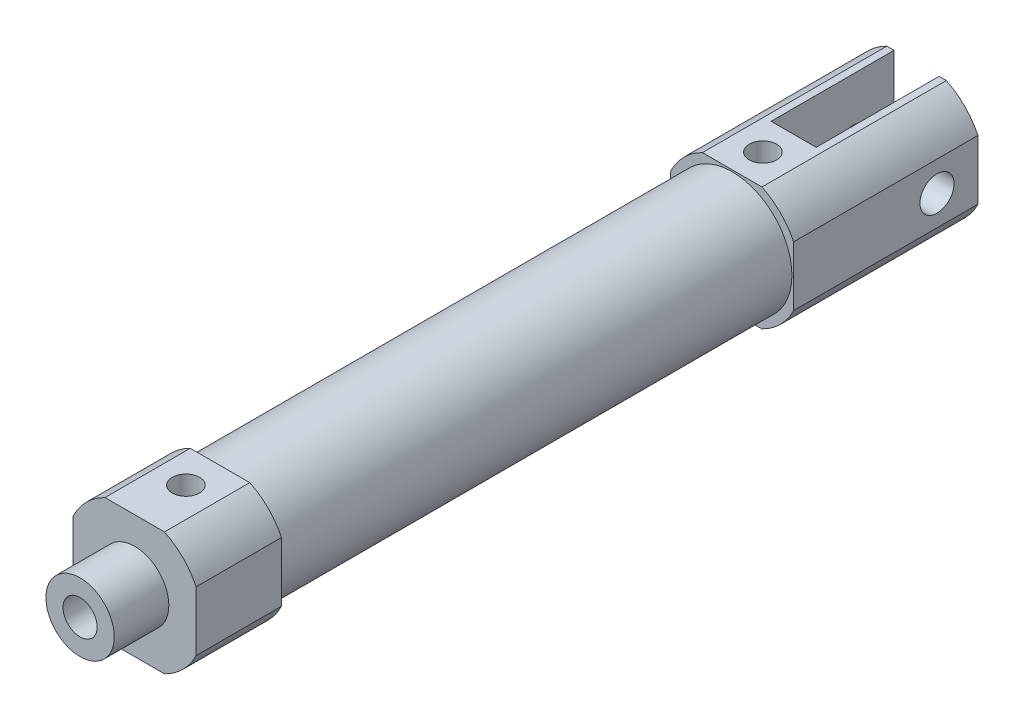
ISO-10303-21;
HEADER;
FILE_DESCRIPTION(('STEP AP214'),'2;1');
FILE_NAME('part.step','',(''),(''),'','','');
FILE_SCHEMA(('AUTOMOTIVE_DESIGN { 1 0 10303 214 1 1 1 1 }'));
ENDSEC;
DATA;
#1=APPLICATION_CONTEXT('core data for automotive mechanical design processes');
#2=APPLICATION_PROTOCOL_DEFINITION('international standard','automotive_design',2000,#1);
#3=PRODUCT_CONTEXT('',#1,'mechanical');
#4=PRODUCT('Part','Part','',(#3));
#5=PRODUCT_RELATED_PRODUCT_CATEGORY('part','',(#4));
#6=PRODUCT_DEFINITION_FORMATION('','',#4);
#7=PRODUCT_DEFINITION_CONTEXT('part definition',#1,'design');
#8=PRODUCT_DEFINITION('design','',#6,#7);
#9=PRODUCT_DEFINITION_SHAPE('','',#8);
#10=(LENGTH_UNIT() NAMED_UNIT(*) SI_UNIT(.MILLI.,.METRE.));
#11=(NAMED_UNIT(*) PLANE_ANGLE_UNIT() SI_UNIT($,.RADIAN.));
#12=(NAMED_UNIT(*) SI_UNIT($,.STERADIAN.) SOLID_ANGLE_UNIT());
#13=UNCERTAINTY_MEASURE_WITH_UNIT(LENGTH_MEASURE(1.E-05),#10,'distance_accuracy_value','');
#14=(GEOMETRIC_REPRESENTATION_CONTEXT(3) GLOBAL_UNCERTAINTY_ASSIGNED_CONTEXT((#13)) GLOBAL_UNIT_ASSIGNED_CONTEXT((#10,
#11,#12)) REPRESENTATION_CONTEXT('',''));
#15=CARTESIAN_POINT('',(0.,0.,0.));
#16=DIRECTION('',(0.,0.,1.));
#17=DIRECTION('',(1.,0.,0.));
#18=AXIS2_PLACEMENT_3D('',#15,#16,#17);
#19=CARTESIAN_POINT('',(-4.35889894354067,9.,27.));
#20=DIRECTION('',(0.,-1.,0.));
#21=DIRECTION('',(1.,0.,0.));
#22=AXIS2_PLACEMENT_3D('',#19,#20,#21);
#23=PLANE('',#22);
#24=CARTESIAN_POINT('',(0.,9.,22.5));
#25=DIRECTION('',(0.,1.,0.));
#26=DIRECTION('',(-1.,0.,0.));
#27=AXIS2_PLACEMENT_3D('',#24,#25,#26);
#28=CIRCLE('',#27,2.);
#29=CARTESIAN_POINT('',(-2.,9.,22.5));
#30=VERTEX_POINT('',#29);
#31=EDGE_CURVE('E317',#30,#30,#28,.T.);
#32=ORIENTED_EDGE('',*,*,#31,.F.);
#33=EDGE_LOOP('',(#32));
#34=FACE_BOUND('',#33,.T.);
#35=DIRECTION('',(0.,0.,-1.));
#36=VECTOR('',#35,1.);
#37=CARTESIAN_POINT('',(-3.3,9.,13.5));
#38=LINE('',#37,#36);
#39=CARTESIAN_POINT('',(-3.3,9.,18.));
#40=VERTEX_POINT('',#39);
#41=CARTESIAN_POINT('',(-3.3,9.,0.));
#42=VERTEX_POINT('',#41);
#43=EDGE_CURVE('E307',#40,#42,#38,.T.);
#44=ORIENTED_EDGE('',*,*,#43,.T.);
#45=DIRECTION('',(-1.,0.,0.));
#46=VECTOR('',#45,1.);
#47=CARTESIAN_POINT('',(-4.35889894354067,9.,0.));
#48=LINE('',#47,#46);
#49=CARTESIAN_POINT('',(-4.35889894354068,9.,0.));
#50=VERTEX_POINT('',#49);
#51=EDGE_CURVE('E152',#42,#50,#48,.T.);
#52=ORIENTED_EDGE('',*,*,#51,.T.);
#53=DIRECTION('',(0.,0.,-1.));
#54=VECTOR('',#53,1.);
#55=CARTESIAN_POINT('',(-4.35889894354068,9.,27.));
#56=LINE('',#55,#54);
#57=CARTESIAN_POINT('',(-4.35889894354068,9.,27.));
#58=VERTEX_POINT('',#57);
#59=EDGE_CURVE('E168',#58,#50,#56,.T.);
#60=ORIENTED_EDGE('',*,*,#59,.F.);
#61=DIRECTION('',(-1.,0.,0.));
#62=VECTOR('',#61,1.);
#63=CARTESIAN_POINT('',(-4.35889894354067,9.,27.));
#64=LINE('',#63,#62);
#65=CARTESIAN_POINT('',(4.35889894354068,9.,27.));
#66=VERTEX_POINT('',#65);
#67=EDGE_CURVE('E192',#66,#58,#64,.T.);
#68=ORIENTED_EDGE('',*,*,#67,.F.);
#69=DIRECTION('',(0.,0.,-1.));
#70=VECTOR('',#69,1.);
#71=CARTESIAN_POINT('',(4.35889894354068,9.,27.));
#72=LINE('',#71,#70);
#73=CARTESIAN_POINT('',(4.35889894354068,9.,0.));
#74=VERTEX_POINT('',#73);
#75=EDGE_CURVE('E171',#66,#74,#72,.T.);
#76=ORIENTED_EDGE('',*,*,#75,.T.);
#77=CARTESIAN_POINT('',(3.3,9.,0.));
#78=VERTEX_POINT('',#77);
#79=EDGE_CURVE('E153',#74,#78,#48,.T.);
#80=ORIENTED_EDGE('',*,*,#79,.T.);
#81=DIRECTION('',(0.,0.,1.));
#82=VECTOR('',#81,1.);
#83=CARTESIAN_POINT('',(3.3,9.,13.5));
#84=LINE('',#83,#82);
#85=CARTESIAN_POINT('',(3.3,9.,18.));
#86=VERTEX_POINT('',#85);
#87=EDGE_CURVE('E48',#78,#86,#84,.T.);
#88=ORIENTED_EDGE('',*,*,#87,.T.);
#89=DIRECTION('',(-1.,0.,0.));
#90=VECTOR('',#89,1.);
#91=CARTESIAN_POINT('',(-22.2100642687501,9.00000000000001,18.));
#92=LINE('',#91,#90);
#93=EDGE_CURVE('E305',#86,#40,#92,.T.);
#94=ORIENTED_EDGE('',*,*,#93,.T.);
#95=EDGE_LOOP('',(#44,#52,#60,#68,#76,#80,#88,#94));
#96=FACE_BOUND('',#95,.T.);
#97=ADVANCED_FACE('F32',(#34,#96),#23,.F.);
#98=CARTESIAN_POINT('',(-4.35889894354067,-9.,27.));
#99=DIRECTION('',(0.,1.,0.));
#100=DIRECTION('',(-1.,0.,0.));
#101=AXIS2_PLACEMENT_3D('',#98,#99,#100);
#102=PLANE('',#101);
#103=DIRECTION('',(0.,0.,-1.));
#104=VECTOR('',#103,1.);
#105=CARTESIAN_POINT('',(-3.3,-9.,13.5));
#106=LINE('',#105,#104);
#107=CARTESIAN_POINT('',(-3.3,-9.,18.));
#108=VERTEX_POINT('',#107);
#109=CARTESIAN_POINT('',(-3.3,-9.,0.));
#110=VERTEX_POINT('',#109);
#111=EDGE_CURVE('E304',#108,#110,#106,.T.);
#112=ORIENTED_EDGE('',*,*,#111,.F.);
#113=DIRECTION('',(-1.,0.,0.));
#114=VECTOR('',#113,1.);
#115=CARTESIAN_POINT('',(-22.2100642687501,-8.99999999999999,18.));
#116=LINE('',#115,#114);
#117=CARTESIAN_POINT('',(3.29999999999999,-9.,18.));
#118=VERTEX_POINT('',#117);
#119=EDGE_CURVE('E312',#118,#108,#116,.T.);
#120=ORIENTED_EDGE('',*,*,#119,.F.);
#121=DIRECTION('',(0.,0.,1.));
#122=VECTOR('',#121,1.);
#123=CARTESIAN_POINT('',(3.29999999999999,-9.,13.5));
#124=LINE('',#123,#122);
#125=CARTESIAN_POINT('',(3.29999999999999,-9.,0.));
#126=VERTEX_POINT('',#125);
#127=EDGE_CURVE('E298',#126,#118,#124,.T.);
#128=ORIENTED_EDGE('',*,*,#127,.F.);
#129=DIRECTION('',(1.,0.,0.));
#130=VECTOR('',#129,1.);
#131=CARTESIAN_POINT('',(-4.35889894354067,-9.,0.));
#132=LINE('',#131,#130);
#133=CARTESIAN_POINT('',(4.35889894354068,-9.,0.));
#134=VERTEX_POINT('',#133);
#135=EDGE_CURVE('E90',#126,#134,#132,.T.);
#136=ORIENTED_EDGE('',*,*,#135,.T.);
#137=DIRECTION('',(0.,0.,-1.));
#138=VECTOR('',#137,1.);
#139=CARTESIAN_POINT('',(4.35889894354068,-9.,27.));
#140=LINE('',#139,#138);
#141=CARTESIAN_POINT('',(4.35889894354068,-9.,27.));
#142=VERTEX_POINT('',#141);
#143=EDGE_CURVE('E140',#142,#134,#140,.T.);
#144=ORIENTED_EDGE('',*,*,#143,.F.);
#145=DIRECTION('',(1.,0.,0.));
#146=VECTOR('',#145,1.);
#147=CARTESIAN_POINT('',(-4.35889894354067,-9.,27.));
#148=LINE('',#147,#146);
#149=CARTESIAN_POINT('',(-4.35889894354067,-9.,27.));
#150=VERTEX_POINT('',#149);
#151=EDGE_CURVE('E57',#150,#142,#148,.T.);
#152=ORIENTED_EDGE('',*,*,#151,.F.);
#153=DIRECTION('',(0.,0.,-1.));
#154=VECTOR('',#153,1.);
#155=CARTESIAN_POINT('',(-4.35889894354067,-9.,27.));
#156=LINE('',#155,#154);
#157=CARTESIAN_POINT('',(-4.35889894354067,-9.,0.));
#158=VERTEX_POINT('',#157);
#159=EDGE_CURVE('E135',#150,#158,#156,.T.);
#160=ORIENTED_EDGE('',*,*,#159,.T.);
#161=EDGE_CURVE('E161',#158,#110,#132,.T.);
#162=ORIENTED_EDGE('',*,*,#161,.T.);
#163=EDGE_LOOP('',(#112,#120,#128,#136,#144,#152,#160,#162));
#164=FACE_BOUND('',#163,.T.);
#165=ADVANCED_FACE('F355',(#164),#102,.F.);
#166=CARTESIAN_POINT('',(0.,0.,0.));
#167=DIRECTION('',(0.,0.,1.));
#168=DIRECTION('',(1.,0.,0.));
#169=AXIS2_PLACEMENT_3D('',#166,#167,#168);
#170=PLANE('',#169);
#171=DIRECTION('',(0.,1.,0.));
#172=VECTOR('',#171,1.);
#173=CARTESIAN_POINT('',(-3.3,-9.,0.));
#174=LINE('',#173,#172);
#175=EDGE_CURVE('E291',#110,#42,#174,.T.);
#176=ORIENTED_EDGE('',*,*,#175,.F.);
#177=ORIENTED_EDGE('',*,*,#161,.F.);
#178=CARTESIAN_POINT('',(0.,0.,0.));
#179=DIRECTION('',(0.,0.,1.));
#180=DIRECTION('',(1.,0.,0.));
#181=AXIS2_PLACEMENT_3D('',#178,#179,#180);
#182=CIRCLE('',#181,10.);
#183=CARTESIAN_POINT('',(-9.,-4.35889894354067,0.));
#184=VERTEX_POINT('',#183);
#185=EDGE_CURVE('E159',#184,#158,#182,.T.);
#186=ORIENTED_EDGE('',*,*,#185,.F.);
#187=DIRECTION('',(0.,-1.,0.));
#188=VECTOR('',#187,1.);
#189=CARTESIAN_POINT('',(-9.,-4.35889894354067,0.));
#190=LINE('',#189,#188);
#191=CARTESIAN_POINT('',(-9.,4.35889894354067,0.));
#192=VERTEX_POINT('',#191);
#193=EDGE_CURVE('E131',#192,#184,#190,.T.);
#194=ORIENTED_EDGE('',*,*,#193,.F.);
#195=CARTESIAN_POINT('',(0.,0.,0.));
#196=DIRECTION('',(0.,0.,1.));
#197=DIRECTION('',(1.,0.,0.));
#198=AXIS2_PLACEMENT_3D('',#195,#196,#197);
#199=CIRCLE('',#198,10.);
#200=EDGE_CURVE('E156',#50,#192,#199,.T.);
#201=ORIENTED_EDGE('',*,*,#200,.F.);
#202=ORIENTED_EDGE('',*,*,#51,.F.);
#203=EDGE_LOOP('',(#176,#177,#186,#194,#201,#202));
#204=FACE_BOUND('',#203,.T.);
#205=ADVANCED_FACE('F361',(#204),#170,.F.);
#206=DIRECTION('',(0.,1.,0.));
#207=VECTOR('',#206,1.);
#208=CARTESIAN_POINT('',(3.29999999999999,-9.,0.));
#209=LINE('',#208,#207);
#210=EDGE_CURVE('E185',#126,#78,#209,.T.);
#211=ORIENTED_EDGE('',*,*,#210,.T.);
#212=ORIENTED_EDGE('',*,*,#79,.F.);
#213=CARTESIAN_POINT('',(0.,0.,0.));
#214=DIRECTION('',(0.,0.,1.));
#215=DIRECTION('',(1.,0.,0.));
#216=AXIS2_PLACEMENT_3D('',#213,#214,#215);
#217=CIRCLE('',#216,10.);
#218=CARTESIAN_POINT('',(9.,4.35889894354068,0.));
#219=VERTEX_POINT('',#218);
#220=EDGE_CURVE('E150',#219,#74,#217,.T.);
#221=ORIENTED_EDGE('',*,*,#220,.F.);
#222=DIRECTION('',(0.,1.,0.));
#223=VECTOR('',#222,1.);
#224=CARTESIAN_POINT('',(9.,-4.35889894354068,0.));
#225=LINE('',#224,#223);
#226=CARTESIAN_POINT('',(9.,-4.35889894354068,0.));
#227=VERTEX_POINT('',#226);
#228=EDGE_CURVE('E147',#227,#219,#225,.T.);
#229=ORIENTED_EDGE('',*,*,#228,.F.);
#230=CARTESIAN_POINT('',(0.,0.,0.));
#231=DIRECTION('',(0.,0.,1.));
#232=DIRECTION('',(1.,0.,0.));
#233=AXIS2_PLACEMENT_3D('',#230,#231,#232);
#234=CIRCLE('',#233,10.);
#235=EDGE_CURVE('E144',#134,#227,#234,.T.);
#236=ORIENTED_EDGE('',*,*,#235,.F.);
#237=ORIENTED_EDGE('',*,*,#135,.F.);
#238=EDGE_LOOP('',(#211,#212,#221,#229,#236,#237));
#239=FACE_BOUND('',#238,.T.);
#240=ADVANCED_FACE('F183',(#239),#170,.F.);
#241=CARTESIAN_POINT('',(0.,0.,114.5));
#242=DIRECTION('',(0.,0.,1.));
#243=DIRECTION('',(1.,0.,0.));
#244=AXIS2_PLACEMENT_3D('',#241,#242,#243);
#245=PLANE('',#244);
#246=CARTESIAN_POINT('',(0.,0.,114.5));
#247=DIRECTION('',(0.,0.,1.));
#248=DIRECTION('',(1.,0.,0.));
#249=AXIS2_PLACEMENT_3D('',#246,#247,#248);
#250=CIRCLE('',#249,10.);
#251=CARTESIAN_POINT('',(-9.,-4.35889894354067,114.5));
#252=VERTEX_POINT('',#251);
#253=CARTESIAN_POINT('',(-4.35889894354067,-9.,114.5));
#254=VERTEX_POINT('',#253);
#255=EDGE_CURVE('E231',#252,#254,#250,.T.);
#256=ORIENTED_EDGE('',*,*,#255,.T.);
#257=DIRECTION('',(1.,0.,0.));
#258=VECTOR('',#257,1.);
#259=CARTESIAN_POINT('',(-4.35889894354067,-9.,114.5));
#260=LINE('',#259,#258);
#261=CARTESIAN_POINT('',(4.35889894354067,-9.,114.5));
#262=VERTEX_POINT('',#261);
#263=EDGE_CURVE('E271',#254,#262,#260,.T.);
#264=ORIENTED_EDGE('',*,*,#263,.T.);
#265=CARTESIAN_POINT('',(0.,0.,114.5));
#266=DIRECTION('',(0.,0.,1.));
#267=DIRECTION('',(1.,0.,0.));
#268=AXIS2_PLACEMENT_3D('',#265,#266,#267);
#269=CIRCLE('',#268,10.);
#270=CARTESIAN_POINT('',(9.,-4.35889894354068,114.5));
#271=VERTEX_POINT('',#270);
#272=EDGE_CURVE('E268',#262,#271,#269,.T.);
#273=ORIENTED_EDGE('',*,*,#272,.T.);
#274=DIRECTION('',(0.,1.,0.));
#275=VECTOR('',#274,1.);
#276=CARTESIAN_POINT('',(9.,-4.35889894354067,114.5));
#277=LINE('',#276,#275);
#278=CARTESIAN_POINT('',(9.,4.35889894354067,114.5));
#279=VERTEX_POINT('',#278);
#280=EDGE_CURVE('E265',#271,#279,#277,.T.);
#281=ORIENTED_EDGE('',*,*,#280,.T.);
#282=CARTESIAN_POINT('',(0.,0.,114.5));
#283=DIRECTION('',(0.,0.,1.));
#284=DIRECTION('',(1.,0.,0.));
#285=AXIS2_PLACEMENT_3D('',#282,#283,#284);
#286=CIRCLE('',#285,10.);
#287=CARTESIAN_POINT('',(4.35889894354067,9.,114.5));
#288=VERTEX_POINT('',#287);
#289=EDGE_CURVE('E262',#279,#288,#286,.T.);
#290=ORIENTED_EDGE('',*,*,#289,.T.);
#291=DIRECTION('',(-1.,0.,0.));
#292=VECTOR('',#291,1.);
#293=CARTESIAN_POINT('',(-4.35889894354068,9.,114.5));
#294=LINE('',#293,#292);
#295=CARTESIAN_POINT('',(-4.35889894354068,9.,114.5));
#296=VERTEX_POINT('',#295);
#297=EDGE_CURVE('E259',#288,#296,#294,.T.);
#298=ORIENTED_EDGE('',*,*,#297,.T.);
#299=CARTESIAN_POINT('',(0.,0.,114.5));
#300=DIRECTION('',(0.,0.,1.));
#301=DIRECTION('',(1.,0.,0.));
#302=AXIS2_PLACEMENT_3D('',#299,#300,#301);
#303=CIRCLE('',#302,10.);
#304=CARTESIAN_POINT('',(-9.,4.35889894354067,114.5));
#305=VERTEX_POINT('',#304);
#306=EDGE_CURVE('E256',#296,#305,#303,.T.);
#307=ORIENTED_EDGE('',*,*,#306,.T.);
#308=DIRECTION('',(0.,-1.,0.));
#309=VECTOR('',#308,1.);
#310=CARTESIAN_POINT('',(-9.,-4.35889894354067,114.5));
#311=LINE('',#310,#309);
#312=EDGE_CURVE('E227',#305,#252,#311,.T.);
#313=ORIENTED_EDGE('',*,*,#312,.T.);
#314=EDGE_LOOP('',(#256,#264,#273,#281,#290,#298,#307,#313));
#315=FACE_BOUND('',#314,.T.);
#316=CARTESIAN_POINT('',(0.,0.,114.5));
#317=DIRECTION('',(0.,0.,1.));
#318=DIRECTION('',(1.,0.,0.));
#319=AXIS2_PLACEMENT_3D('',#316,#317,#318);
#320=CIRCLE('',#319,5.);
#321=CARTESIAN_POINT('',(5.,0.,114.5));
#322=VERTEX_POINT('',#321);
#323=EDGE_CURVE('E276',#322,#322,#320,.T.);
#324=ORIENTED_EDGE('',*,*,#323,.F.);
#325=EDGE_LOOP('',(#324));
#326=FACE_BOUND('',#325,.T.);
#327=ADVANCED_FACE('F443',(#315,#326),#245,.T.);
#328=CARTESIAN_POINT('',(0.,0.,27.));
#329=DIRECTION('',(0.,0.,1.));
#330=DIRECTION('',(1.,0.,0.));
#331=AXIS2_PLACEMENT_3D('',#328,#329,#330);
#332=PLANE('',#331);
#333=CARTESIAN_POINT('',(0.,0.,27.));
#334=DIRECTION('',(0.,0.,1.));
#335=DIRECTION('',(1.,0.,0.));
#336=AXIS2_PLACEMENT_3D('',#333,#334,#335);
#337=CIRCLE('',#336,10.);
#338=CARTESIAN_POINT('',(9.,-4.35889894354068,27.));
#339=VERTEX_POINT('',#338);
#340=EDGE_CURVE('E164',#142,#339,#337,.T.);
#341=ORIENTED_EDGE('',*,*,#340,.T.);
#342=DIRECTION('',(0.,1.,0.));
#343=VECTOR('',#342,1.);
#344=CARTESIAN_POINT('',(9.,-4.35889894354068,27.));
#345=LINE('',#344,#343);
#346=CARTESIAN_POINT('',(9.,4.35889894354068,27.));
#347=VERTEX_POINT('',#346);
#348=EDGE_CURVE('E98',#339,#347,#345,.T.);
#349=ORIENTED_EDGE('',*,*,#348,.T.);
#350=CARTESIAN_POINT('',(0.,0.,27.));
#351=DIRECTION('',(0.,0.,1.));
#352=DIRECTION('',(1.,0.,0.));
#353=AXIS2_PLACEMENT_3D('',#350,#351,#352);
#354=CIRCLE('',#353,10.);
#355=EDGE_CURVE('E180',#347,#66,#354,.T.);
#356=ORIENTED_EDGE('',*,*,#355,.T.);
#357=ORIENTED_EDGE('',*,*,#67,.T.);
#358=CARTESIAN_POINT('',(0.,0.,27.));
#359=DIRECTION('',(0.,0.,1.));
#360=DIRECTION('',(1.,0.,0.));
#361=AXIS2_PLACEMENT_3D('',#358,#359,#360);
#362=CIRCLE('',#361,10.);
#363=CARTESIAN_POINT('',(-9.,4.35889894354067,27.));
#364=VERTEX_POINT('',#363);
#365=EDGE_CURVE('E122',#58,#364,#362,.T.);
#366=ORIENTED_EDGE('',*,*,#365,.T.);
#367=DIRECTION('',(0.,-1.,0.));
#368=VECTOR('',#367,1.);
#369=CARTESIAN_POINT('',(-9.,-4.35889894354067,27.));
#370=LINE('',#369,#368);
#371=CARTESIAN_POINT('',(-9.,-4.35889894354067,27.));
#372=VERTEX_POINT('',#371);
#373=EDGE_CURVE('E114',#364,#372,#370,.T.);
#374=ORIENTED_EDGE('',*,*,#373,.T.);
#375=CARTESIAN_POINT('',(0.,0.,27.));
#376=DIRECTION('',(0.,0.,1.));
#377=DIRECTION('',(1.,0.,0.));
#378=AXIS2_PLACEMENT_3D('',#375,#376,#377);
#379=CIRCLE('',#378,10.);
#380=EDGE_CURVE('E119',#372,#150,#379,.T.);
#381=ORIENTED_EDGE('',*,*,#380,.T.);
#382=ORIENTED_EDGE('',*,*,#151,.T.);
#383=EDGE_LOOP('',(#341,#349,#356,#357,#366,#374,#381,#382));
#384=FACE_BOUND('',#383,.T.);
#385=CARTESIAN_POINT('',(0.,0.,27.));
#386=DIRECTION('',(0.,0.,1.));
#387=DIRECTION('',(1.,0.,0.));
#388=AXIS2_PLACEMENT_3D('',#385,#386,#387);
#389=CIRCLE('',#388,8.75);
#390=CARTESIAN_POINT('',(8.75,0.,27.));
#391=VERTEX_POINT('',#390);
#392=EDGE_CURVE('E198',#391,#391,#389,.T.);
#393=ORIENTED_EDGE('',*,*,#392,.F.);
#394=EDGE_LOOP('',(#393));
#395=FACE_BOUND('',#394,.T.);
#396=ADVANCED_FACE('F116',(#384,#395),#332,.T.);
#397=CARTESIAN_POINT('',(0.,0.,27.));
#398=DIRECTION('',(0.,0.,-1.));
#399=DIRECTION('',(-1.,0.,0.));
#400=AXIS2_PLACEMENT_3D('',#397,#398,#399);
#401=CYLINDRICAL_SURFACE('',#400,10.);
#402=ORIENTED_EDGE('',*,*,#235,.T.);
#403=DIRECTION('',(0.,0.,-1.));
#404=VECTOR('',#403,1.);
#405=CARTESIAN_POINT('',(9.,-4.35889894354068,27.));
#406=LINE('',#405,#404);
#407=EDGE_CURVE('E11',#339,#227,#406,.T.);
#408=ORIENTED_EDGE('',*,*,#407,.F.);
#409=ORIENTED_EDGE('',*,*,#340,.F.);
#410=ORIENTED_EDGE('',*,*,#143,.T.);
#411=EDGE_LOOP('',(#402,#408,#409,#410));
#412=FACE_BOUND('',#411,.T.);
#413=ADVANCED_FACE('F34',(#412),#401,.T.);
#414=CARTESIAN_POINT('',(9.,-4.35889894354068,27.));
#415=DIRECTION('',(-1.,0.,0.));
#416=DIRECTION('',(0.,0.,1.));
#417=AXIS2_PLACEMENT_3D('',#414,#415,#416);
#418=PLANE('',#417);
#419=CARTESIAN_POINT('',(9.,0.,6.));
#420=DIRECTION('',(-1.,0.,0.));
#421=DIRECTION('',(0.,0.,1.));
#422=AXIS2_PLACEMENT_3D('',#419,#420,#421);
#423=CIRCLE('',#422,2.5);
#424=CARTESIAN_POINT('',(9.,0.,8.5));
#425=VERTEX_POINT('',#424);
#426=EDGE_CURVE('E328',#425,#425,#423,.T.);
#427=ORIENTED_EDGE('',*,*,#426,.T.);
#428=EDGE_LOOP('',(#427));
#429=FACE_BOUND('',#428,.T.);
#430=ORIENTED_EDGE('',*,*,#228,.T.);
#431=DIRECTION('',(0.,0.,-1.));
#432=VECTOR('',#431,1.);
#433=CARTESIAN_POINT('',(9.,4.35889894354068,27.));
#434=LINE('',#433,#432);
#435=EDGE_CURVE('E41',#347,#219,#434,.T.);
#436=ORIENTED_EDGE('',*,*,#435,.F.);
#437=ORIENTED_EDGE('',*,*,#348,.F.);
#438=ORIENTED_EDGE('',*,*,#407,.T.);
#439=EDGE_LOOP('',(#430,#436,#437,#438));
#440=FACE_BOUND('',#439,.T.);
#441=ADVANCED_FACE('F369',(#429,#440),#418,.F.);
#442=CARTESIAN_POINT('',(0.,0.,27.));
#443=DIRECTION('',(0.,0.,-1.));
#444=DIRECTION('',(-1.,0.,0.));
#445=AXIS2_PLACEMENT_3D('',#442,#443,#444);
#446=CYLINDRICAL_SURFACE('',#445,10.);
#447=ORIENTED_EDGE('',*,*,#220,.T.);
#448=ORIENTED_EDGE('',*,*,#75,.F.);
#449=ORIENTED_EDGE('',*,*,#355,.F.);
#450=ORIENTED_EDGE('',*,*,#435,.T.);
#451=EDGE_LOOP('',(#447,#448,#449,#450));
#452=FACE_BOUND('',#451,.T.);
#453=ADVANCED_FACE('F178',(#452),#446,.T.);
#454=CARTESIAN_POINT('',(0.,0.,27.));
#455=DIRECTION('',(0.,0.,-1.));
#456=DIRECTION('',(-1.,0.,0.));
#457=AXIS2_PLACEMENT_3D('',#454,#455,#456);
#458=CYLINDRICAL_SURFACE('',#457,10.);
#459=ORIENTED_EDGE('',*,*,#200,.T.);
#460=DIRECTION('',(0.,0.,-1.));
#461=VECTOR('',#460,1.);
#462=CARTESIAN_POINT('',(-9.,4.35889894354067,27.));
#463=LINE('',#462,#461);
#464=EDGE_CURVE('E134',#364,#192,#463,.T.);
#465=ORIENTED_EDGE('',*,*,#464,.F.);
#466=ORIENTED_EDGE('',*,*,#365,.F.);
#467=ORIENTED_EDGE('',*,*,#59,.T.);
#468=EDGE_LOOP('',(#459,#465,#466,#467));
#469=FACE_BOUND('',#468,.T.);
#470=ADVANCED_FACE('F366',(#469),#458,.T.);
#471=CARTESIAN_POINT('',(-9.,-4.35889894354067,27.));
#472=DIRECTION('',(1.,0.,0.));
#473=DIRECTION('',(0.,0.,-1.));
#474=AXIS2_PLACEMENT_3D('',#471,#472,#473);
#475=PLANE('',#474);
#476=CARTESIAN_POINT('',(-9.,0.,6.));
#477=DIRECTION('',(-1.,0.,0.));
#478=DIRECTION('',(0.,0.,1.));
#479=AXIS2_PLACEMENT_3D('',#476,#477,#478);
#480=CIRCLE('',#479,2.5);
#481=CARTESIAN_POINT('',(-9.,0.,8.5));
#482=VERTEX_POINT('',#481);
#483=EDGE_CURVE('E325',#482,#482,#480,.T.);
#484=ORIENTED_EDGE('',*,*,#483,.F.);
#485=EDGE_LOOP('',(#484));
#486=FACE_BOUND('',#485,.T.);
#487=ORIENTED_EDGE('',*,*,#193,.T.);
#488=DIRECTION('',(0.,0.,-1.));
#489=VECTOR('',#488,1.);
#490=CARTESIAN_POINT('',(-9.,-4.35889894354067,27.));
#491=LINE('',#490,#489);
#492=EDGE_CURVE('E128',#372,#184,#491,.T.);
#493=ORIENTED_EDGE('',*,*,#492,.F.);
#494=ORIENTED_EDGE('',*,*,#373,.F.);
#495=ORIENTED_EDGE('',*,*,#464,.T.);
#496=EDGE_LOOP('',(#487,#493,#494,#495));
#497=FACE_BOUND('',#496,.T.);
#498=ADVANCED_FACE('F129',(#486,#497),#475,.F.);
#499=CARTESIAN_POINT('',(0.,0.,27.));
#500=DIRECTION('',(0.,0.,-1.));
#501=DIRECTION('',(-1.,0.,0.));
#502=AXIS2_PLACEMENT_3D('',#499,#500,#501);
#503=CYLINDRICAL_SURFACE('',#502,10.);
#504=ORIENTED_EDGE('',*,*,#185,.T.);
#505=ORIENTED_EDGE('',*,*,#159,.F.);
#506=ORIENTED_EDGE('',*,*,#380,.F.);
#507=ORIENTED_EDGE('',*,*,#492,.T.);
#508=EDGE_LOOP('',(#504,#505,#506,#507));
#509=FACE_BOUND('',#508,.T.);
#510=ADVANCED_FACE('F137',(#509),#503,.T.);
#511=CARTESIAN_POINT('',(0.,0.,102.));
#512=DIRECTION('',(0.,0.,-1.));
#513=DIRECTION('',(-1.,0.,0.));
#514=AXIS2_PLACEMENT_3D('',#511,#512,#513);
#515=CYLINDRICAL_SURFACE('',#514,8.75);
#516=CARTESIAN_POINT('',(0.,0.,102.));
#517=DIRECTION('',(0.,0.,1.));
#518=DIRECTION('',(1.,0.,0.));
#519=AXIS2_PLACEMENT_3D('',#516,#517,#518);
#520=CIRCLE('',#519,8.75);
#521=CARTESIAN_POINT('',(8.75,0.,102.));
#522=VERTEX_POINT('',#521);
#523=EDGE_CURVE('E148',#522,#522,#520,.T.);
#524=ORIENTED_EDGE('',*,*,#523,.F.);
#525=EDGE_LOOP('',(#524));
#526=FACE_BOUND('',#525,.T.);
#527=ORIENTED_EDGE('',*,*,#392,.T.);
#528=EDGE_LOOP('',(#527));
#529=FACE_BOUND('',#528,.T.);
#530=ADVANCED_FACE('F478',(#526,#529),#515,.T.);
#531=CARTESIAN_POINT('',(0.,0.,102.));
#532=DIRECTION('',(0.,0.,1.));
#533=DIRECTION('',(1.,0.,0.));
#534=AXIS2_PLACEMENT_3D('',#531,#532,#533);
#535=PLANE('',#534);
#536=CARTESIAN_POINT('',(0.,0.,102.));
#537=DIRECTION('',(0.,0.,1.));
#538=DIRECTION('',(1.,0.,0.));
#539=AXIS2_PLACEMENT_3D('',#536,#537,#538);
#540=CIRCLE('',#539,10.);
#541=CARTESIAN_POINT('',(-9.,-4.35889894354067,102.));
#542=VERTEX_POINT('',#541);
#543=CARTESIAN_POINT('',(-4.35889894354067,-9.,102.));
#544=VERTEX_POINT('',#543);
#545=EDGE_CURVE('E250',#542,#544,#540,.T.);
#546=ORIENTED_EDGE('',*,*,#545,.F.);
#547=DIRECTION('',(0.,-1.,0.));
#548=VECTOR('',#547,1.);
#549=CARTESIAN_POINT('',(-9.,-4.35889894354067,102.));
#550=LINE('',#549,#548);
#551=CARTESIAN_POINT('',(-9.,4.35889894354067,102.));
#552=VERTEX_POINT('',#551);
#553=EDGE_CURVE('E228',#552,#542,#550,.T.);
#554=ORIENTED_EDGE('',*,*,#553,.F.);
#555=CARTESIAN_POINT('',(0.,0.,102.));
#556=DIRECTION('',(0.,0.,1.));
#557=DIRECTION('',(1.,0.,0.));
#558=AXIS2_PLACEMENT_3D('',#555,#556,#557);
#559=CIRCLE('',#558,10.);
#560=CARTESIAN_POINT('',(-4.35889894354068,9.,102.));
#561=VERTEX_POINT('',#560);
#562=EDGE_CURVE('E232',#561,#552,#559,.T.);
#563=ORIENTED_EDGE('',*,*,#562,.F.);
#564=DIRECTION('',(-1.,0.,0.));
#565=VECTOR('',#564,1.);
#566=CARTESIAN_POINT('',(-4.35889894354068,9.,102.));
#567=LINE('',#566,#565);
#568=CARTESIAN_POINT('',(4.35889894354067,9.,102.));
#569=VERTEX_POINT('',#568);
#570=EDGE_CURVE('E235',#569,#561,#567,.T.);
#571=ORIENTED_EDGE('',*,*,#570,.F.);
#572=CARTESIAN_POINT('',(0.,0.,102.));
#573=DIRECTION('',(0.,0.,1.));
#574=DIRECTION('',(1.,0.,0.));
#575=AXIS2_PLACEMENT_3D('',#572,#573,#574);
#576=CIRCLE('',#575,10.);
#577=CARTESIAN_POINT('',(9.,4.35889894354067,102.));
#578=VERTEX_POINT('',#577);
#579=EDGE_CURVE('E238',#578,#569,#576,.T.);
#580=ORIENTED_EDGE('',*,*,#579,.F.);
#581=DIRECTION('',(0.,1.,0.));
#582=VECTOR('',#581,1.);
#583=CARTESIAN_POINT('',(9.,-4.35889894354067,102.));
#584=LINE('',#583,#582);
#585=CARTESIAN_POINT('',(9.,-4.35889894354068,102.));
#586=VERTEX_POINT('',#585);
#587=EDGE_CURVE('E241',#586,#578,#584,.T.);
#588=ORIENTED_EDGE('',*,*,#587,.F.);
#589=CARTESIAN_POINT('',(0.,0.,102.));
#590=DIRECTION('',(0.,0.,1.));
#591=DIRECTION('',(1.,0.,0.));
#592=AXIS2_PLACEMENT_3D('',#589,#590,#591);
#593=CIRCLE('',#592,10.);
#594=CARTESIAN_POINT('',(4.35889894354067,-9.,102.));
#595=VERTEX_POINT('',#594);
#596=EDGE_CURVE('E244',#595,#586,#593,.T.);
#597=ORIENTED_EDGE('',*,*,#596,.F.);
#598=DIRECTION('',(1.,0.,0.));
#599=VECTOR('',#598,1.);
#600=CARTESIAN_POINT('',(-4.35889894354067,-9.,102.));
#601=LINE('',#600,#599);
#602=EDGE_CURVE('E247',#544,#595,#601,.T.);
#603=ORIENTED_EDGE('',*,*,#602,.F.);
#604=EDGE_LOOP('',(#546,#554,#563,#571,#580,#588,#597,#603));
#605=FACE_BOUND('',#604,.T.);
#606=ORIENTED_EDGE('',*,*,#523,.T.);
#607=EDGE_LOOP('',(#606));
#608=FACE_BOUND('',#607,.T.);
#609=ADVANCED_FACE('F434',(#605,#608),#535,.F.);
#610=CARTESIAN_POINT('',(0.,0.,114.5));
#611=DIRECTION('',(0.,0.,-1.));
#612=DIRECTION('',(-1.,0.,0.));
#613=AXIS2_PLACEMENT_3D('',#610,#611,#612);
#614=CYLINDRICAL_SURFACE('',#613,10.);
#615=ORIENTED_EDGE('',*,*,#545,.T.);
#616=DIRECTION('',(0.,0.,-1.));
#617=VECTOR('',#616,1.);
#618=CARTESIAN_POINT('',(-4.35889894354067,-9.,114.5));
#619=LINE('',#618,#617);
#620=EDGE_CURVE('E201',#254,#544,#619,.T.);
#621=ORIENTED_EDGE('',*,*,#620,.F.);
#622=ORIENTED_EDGE('',*,*,#255,.F.);
#623=DIRECTION('',(0.,0.,-1.));
#624=VECTOR('',#623,1.);
#625=CARTESIAN_POINT('',(-9.,-4.35889894354067,114.5));
#626=LINE('',#625,#624);
#627=EDGE_CURVE('E224',#252,#542,#626,.T.);
#628=ORIENTED_EDGE('',*,*,#627,.T.);
#629=EDGE_LOOP('',(#615,#621,#622,#628));
#630=FACE_BOUND('',#629,.T.);
#631=ADVANCED_FACE('F432',(#630),#614,.T.);
#632=CARTESIAN_POINT('',(-4.35889894354067,-9.,114.5));
#633=DIRECTION('',(0.,1.,0.));
#634=DIRECTION('',(0.,0.,1.));
#635=AXIS2_PLACEMENT_3D('',#632,#633,#634);
#636=PLANE('',#635);
#637=ORIENTED_EDGE('',*,*,#602,.T.);
#638=DIRECTION('',(0.,0.,-1.));
#639=VECTOR('',#638,1.);
#640=CARTESIAN_POINT('',(4.35889894354067,-9.,114.5));
#641=LINE('',#640,#639);
#642=EDGE_CURVE('E206',#262,#595,#641,.T.);
#643=ORIENTED_EDGE('',*,*,#642,.F.);
#644=ORIENTED_EDGE('',*,*,#263,.F.);
#645=ORIENTED_EDGE('',*,*,#620,.T.);
#646=EDGE_LOOP('',(#637,#643,#644,#645));
#647=FACE_BOUND('',#646,.T.);
#648=ADVANCED_FACE('F440',(#647),#636,.F.);
#649=CARTESIAN_POINT('',(0.,0.,114.5));
#650=DIRECTION('',(0.,0.,-1.));
#651=DIRECTION('',(-1.,0.,0.));
#652=AXIS2_PLACEMENT_3D('',#649,#650,#651);
#653=CYLINDRICAL_SURFACE('',#652,10.);
#654=ORIENTED_EDGE('',*,*,#596,.T.);
#655=DIRECTION('',(0.,0.,-1.));
#656=VECTOR('',#655,1.);
#657=CARTESIAN_POINT('',(9.,-4.35889894354068,114.5));
#658=LINE('',#657,#656);
#659=EDGE_CURVE('E209',#271,#586,#658,.T.);
#660=ORIENTED_EDGE('',*,*,#659,.F.);
#661=ORIENTED_EDGE('',*,*,#272,.F.);
#662=ORIENTED_EDGE('',*,*,#642,.T.);
#663=EDGE_LOOP('',(#654,#660,#661,#662));
#664=FACE_BOUND('',#663,.T.);
#665=ADVANCED_FACE('F469',(#664),#653,.T.);
#666=CARTESIAN_POINT('',(9.,-4.35889894354067,114.5));
#667=DIRECTION('',(-1.,0.,0.));
#668=DIRECTION('',(0.,0.,1.));
#669=AXIS2_PLACEMENT_3D('',#666,#667,#668);
#670=PLANE('',#669);
#671=ORIENTED_EDGE('',*,*,#587,.T.);
#672=DIRECTION('',(0.,0.,-1.));
#673=VECTOR('',#672,1.);
#674=CARTESIAN_POINT('',(9.,4.35889894354067,114.5));
#675=LINE('',#674,#673);
#676=EDGE_CURVE('E212',#279,#578,#675,.T.);
#677=ORIENTED_EDGE('',*,*,#676,.F.);
#678=ORIENTED_EDGE('',*,*,#280,.F.);
#679=ORIENTED_EDGE('',*,*,#659,.T.);
#680=EDGE_LOOP('',(#671,#677,#678,#679));
#681=FACE_BOUND('',#680,.T.);
#682=ADVANCED_FACE('F465',(#681),#670,.F.);
#683=CARTESIAN_POINT('',(0.,0.,114.5));
#684=DIRECTION('',(0.,0.,-1.));
#685=DIRECTION('',(-1.,0.,0.));
#686=AXIS2_PLACEMENT_3D('',#683,#684,#685);
#687=CYLINDRICAL_SURFACE('',#686,10.);
#688=ORIENTED_EDGE('',*,*,#579,.T.);
#689=DIRECTION('',(0.,0.,-1.));
#690=VECTOR('',#689,1.);
#691=CARTESIAN_POINT('',(4.35889894354067,9.,114.5));
#692=LINE('',#691,#690);
#693=EDGE_CURVE('E215',#288,#569,#692,.T.);
#694=ORIENTED_EDGE('',*,*,#693,.F.);
#695=ORIENTED_EDGE('',*,*,#289,.F.);
#696=ORIENTED_EDGE('',*,*,#676,.T.);
#697=EDGE_LOOP('',(#688,#694,#695,#696));
#698=FACE_BOUND('',#697,.T.);
#699=ADVANCED_FACE('F458',(#698),#687,.T.);
#700=CARTESIAN_POINT('',(-4.35889894354068,9.,114.5));
#701=DIRECTION('',(0.,-1.,0.));
#702=DIRECTION('',(0.,0.,-1.));
#703=AXIS2_PLACEMENT_3D('',#700,#701,#702);
#704=PLANE('',#703);
#705=CARTESIAN_POINT('',(0.,9.,107.));
#706=DIRECTION('',(0.,1.,0.));
#707=DIRECTION('',(0.,0.,1.));
#708=AXIS2_PLACEMENT_3D('',#705,#706,#707);
#709=CIRCLE('',#708,2.);
#710=CARTESIAN_POINT('',(0.,9.,109.));
#711=VERTEX_POINT('',#710);
#712=EDGE_CURVE('E288',#711,#711,#709,.T.);
#713=ORIENTED_EDGE('',*,*,#712,.F.);
#714=EDGE_LOOP('',(#713));
#715=FACE_BOUND('',#714,.T.);
#716=ORIENTED_EDGE('',*,*,#570,.T.);
#717=DIRECTION('',(0.,0.,-1.));
#718=VECTOR('',#717,1.);
#719=CARTESIAN_POINT('',(-4.35889894354068,9.,114.5));
#720=LINE('',#719,#718);
#721=EDGE_CURVE('E218',#296,#561,#720,.T.);
#722=ORIENTED_EDGE('',*,*,#721,.F.);
#723=ORIENTED_EDGE('',*,*,#297,.F.);
#724=ORIENTED_EDGE('',*,*,#693,.T.);
#725=EDGE_LOOP('',(#716,#722,#723,#724));
#726=FACE_BOUND('',#725,.T.);
#727=ADVANCED_FACE('F450',(#715,#726),#704,.F.);
#728=CARTESIAN_POINT('',(0.,0.,114.5));
#729=DIRECTION('',(0.,0.,-1.));
#730=DIRECTION('',(-1.,0.,0.));
#731=AXIS2_PLACEMENT_3D('',#728,#729,#730);
#732=CYLINDRICAL_SURFACE('',#731,10.);
#733=ORIENTED_EDGE('',*,*,#562,.T.);
#734=DIRECTION('',(0.,0.,-1.));
#735=VECTOR('',#734,1.);
#736=CARTESIAN_POINT('',(-9.,4.35889894354067,114.5));
#737=LINE('',#736,#735);
#738=EDGE_CURVE('E221',#305,#552,#737,.T.);
#739=ORIENTED_EDGE('',*,*,#738,.F.);
#740=ORIENTED_EDGE('',*,*,#306,.F.);
#741=ORIENTED_EDGE('',*,*,#721,.T.);
#742=EDGE_LOOP('',(#733,#739,#740,#741));
#743=FACE_BOUND('',#742,.T.);
#744=ADVANCED_FACE('F448',(#743),#732,.T.);
#745=CARTESIAN_POINT('',(-9.,-4.35889894354067,114.5));
#746=DIRECTION('',(1.,0.,0.));
#747=DIRECTION('',(0.,1.,0.));
#748=AXIS2_PLACEMENT_3D('',#745,#746,#747);
#749=PLANE('',#748);
#750=ORIENTED_EDGE('',*,*,#553,.T.);
#751=ORIENTED_EDGE('',*,*,#627,.F.);
#752=ORIENTED_EDGE('',*,*,#312,.F.);
#753=ORIENTED_EDGE('',*,*,#738,.T.);
#754=EDGE_LOOP('',(#750,#751,#752,#753));
#755=FACE_BOUND('',#754,.T.);
#756=ADVANCED_FACE('F426',(#755),#749,.F.);
#757=CARTESIAN_POINT('',(0.,0.,122.5));
#758=DIRECTION('',(0.,0.,-1.));
#759=DIRECTION('',(-1.,0.,0.));
#760=AXIS2_PLACEMENT_3D('',#757,#758,#759);
#761=CYLINDRICAL_SURFACE('',#760,5.);
#762=CARTESIAN_POINT('',(0.,0.,122.5));
#763=DIRECTION('',(0.,0.,1.));
#764=DIRECTION('',(1.,0.,0.));
#765=AXIS2_PLACEMENT_3D('',#762,#763,#764);
#766=CIRCLE('',#765,5.);
#767=CARTESIAN_POINT('',(5.,0.,122.5));
#768=VERTEX_POINT('',#767);
#769=EDGE_CURVE('E253',#768,#768,#766,.T.);
#770=ORIENTED_EDGE('',*,*,#769,.F.);
#771=EDGE_LOOP('',(#770));
#772=FACE_BOUND('',#771,.T.);
#773=ORIENTED_EDGE('',*,*,#323,.T.);
#774=EDGE_LOOP('',(#773));
#775=FACE_BOUND('',#774,.T.);
#776=ADVANCED_FACE('F456',(#772,#775),#761,.T.);
#777=CARTESIAN_POINT('',(0.,0.,122.5));
#778=DIRECTION('',(0.,0.,1.));
#779=DIRECTION('',(1.,0.,0.));
#780=AXIS2_PLACEMENT_3D('',#777,#778,#779);
#781=PLANE('',#780);
#782=CARTESIAN_POINT('',(0.,0.,122.5));
#783=DIRECTION('',(0.,0.,1.));
#784=DIRECTION('',(1.,0.,0.));
#785=AXIS2_PLACEMENT_3D('',#782,#783,#784);
#786=CIRCLE('',#785,2.5);
#787=CARTESIAN_POINT('',(2.5,0.,122.5));
#788=VERTEX_POINT('',#787);
#789=EDGE_CURVE('E282',#788,#788,#786,.T.);
#790=ORIENTED_EDGE('',*,*,#789,.F.);
#791=EDGE_LOOP('',(#790));
#792=FACE_BOUND('',#791,.T.);
#793=ORIENTED_EDGE('',*,*,#769,.T.);
#794=EDGE_LOOP('',(#793));
#795=FACE_BOUND('',#794,.T.);
#796=ADVANCED_FACE('F647',(#792,#795),#781,.T.);
#797=CARTESIAN_POINT('',(0.,0.,72.5));
#798=DIRECTION('',(0.,0.,1.));
#799=DIRECTION('',(1.,0.,0.));
#800=AXIS2_PLACEMENT_3D('',#797,#798,#799);
#801=CYLINDRICAL_SURFACE('',#800,2.5);
#802=CARTESIAN_POINT('',(0.,0.,72.5));
#803=DIRECTION('',(0.,0.,1.));
#804=DIRECTION('',(1.,0.,0.));
#805=AXIS2_PLACEMENT_3D('',#802,#803,#804);
#806=CIRCLE('',#805,2.5);
#807=CARTESIAN_POINT('',(2.5,0.,72.5));
#808=VERTEX_POINT('',#807);
#809=EDGE_CURVE('E279',#808,#808,#806,.T.);
#810=ORIENTED_EDGE('',*,*,#809,.F.);
#811=EDGE_LOOP('',(#810));
#812=FACE_BOUND('',#811,.T.);
#813=ORIENTED_EDGE('',*,*,#789,.T.);
#814=EDGE_LOOP('',(#813));
#815=FACE_BOUND('',#814,.T.);
#816=ADVANCED_FACE('F657',(#812,#815),#801,.F.);
#817=CARTESIAN_POINT('',(0.,0.,72.5));
#818=DIRECTION('',(0.,0.,1.));
#819=DIRECTION('',(1.,0.,0.));
#820=AXIS2_PLACEMENT_3D('',#817,#818,#819);
#821=PLANE('',#820);
#822=ORIENTED_EDGE('',*,*,#809,.T.);
#823=EDGE_LOOP('',(#822));
#824=FACE_BOUND('',#823,.T.);
#825=ADVANCED_FACE('F667',(#824),#821,.T.);
#826=CARTESIAN_POINT('',(0.,5.,107.));
#827=DIRECTION('',(0.,1.,0.));
#828=DIRECTION('',(0.,0.,1.));
#829=AXIS2_PLACEMENT_3D('',#826,#827,#828);
#830=CYLINDRICAL_SURFACE('',#829,2.);
#831=CARTESIAN_POINT('',(0.,5.,107.));
#832=DIRECTION('',(0.,1.,0.));
#833=DIRECTION('',(0.,0.,1.));
#834=AXIS2_PLACEMENT_3D('',#831,#832,#833);
#835=CIRCLE('',#834,2.);
#836=CARTESIAN_POINT('',(0.,5.,109.));
#837=VERTEX_POINT('',#836);
#838=EDGE_CURVE('E285',#837,#837,#835,.T.);
#839=ORIENTED_EDGE('',*,*,#838,.F.);
#840=EDGE_LOOP('',(#839));
#841=FACE_BOUND('',#840,.T.);
#842=ORIENTED_EDGE('',*,*,#712,.T.);
#843=EDGE_LOOP('',(#842));
#844=FACE_BOUND('',#843,.T.);
#845=ADVANCED_FACE('F677',(#841,#844),#830,.F.);
#846=CARTESIAN_POINT('',(0.,5.,107.));
#847=DIRECTION('',(0.,1.,0.));
#848=DIRECTION('',(0.,0.,1.));
#849=AXIS2_PLACEMENT_3D('',#846,#847,#848);
#850=PLANE('',#849);
#851=ORIENTED_EDGE('',*,*,#838,.T.);
#852=EDGE_LOOP('',(#851));
#853=FACE_BOUND('',#852,.T.);
#854=ADVANCED_FACE('F350',(#853),#850,.T.);
#855=CARTESIAN_POINT('',(-3.3,-9.,13.5));
#856=DIRECTION('',(1.,0.,0.));
#857=DIRECTION('',(0.,1.,0.));
#858=AXIS2_PLACEMENT_3D('',#855,#856,#857);
#859=PLANE('',#858);
#860=CARTESIAN_POINT('',(-3.3,0.,6.));
#861=DIRECTION('',(1.,0.,0.));
#862=DIRECTION('',(0.,1.,0.));
#863=AXIS2_PLACEMENT_3D('',#860,#861,#862);
#864=CIRCLE('',#863,2.5);
#865=CARTESIAN_POINT('',(-3.3,2.5,6.));
#866=VERTEX_POINT('',#865);
#867=EDGE_CURVE('E320',#866,#866,#864,.T.);
#868=ORIENTED_EDGE('',*,*,#867,.F.);
#869=EDGE_LOOP('',(#868));
#870=FACE_BOUND('',#869,.T.);
#871=ORIENTED_EDGE('',*,*,#43,.F.);
#872=DIRECTION('',(0.,1.,0.));
#873=VECTOR('',#872,1.);
#874=CARTESIAN_POINT('',(-3.3,-9.,18.));
#875=LINE('',#874,#873);
#876=EDGE_CURVE('E294',#108,#40,#875,.T.);
#877=ORIENTED_EDGE('',*,*,#876,.F.);
#878=ORIENTED_EDGE('',*,*,#111,.T.);
#879=ORIENTED_EDGE('',*,*,#175,.T.);
#880=EDGE_LOOP('',(#871,#877,#878,#879));
#881=FACE_BOUND('',#880,.T.);
#882=ADVANCED_FACE('F341',(#870,#881),#859,.T.);
#883=CARTESIAN_POINT('',(3.29999999999999,-9.,13.5));
#884=DIRECTION('',(-1.,0.,0.));
#885=DIRECTION('',(0.,-1.,0.));
#886=AXIS2_PLACEMENT_3D('',#883,#884,#885);
#887=PLANE('',#886);
#888=CARTESIAN_POINT('',(3.3,0.,6.));
#889=DIRECTION('',(-1.,0.,0.));
#890=DIRECTION('',(0.,-1.,0.));
#891=AXIS2_PLACEMENT_3D('',#888,#889,#890);
#892=CIRCLE('',#891,2.5);
#893=CARTESIAN_POINT('',(3.3,-2.5,6.));
#894=VERTEX_POINT('',#893);
#895=EDGE_CURVE('E36',#894,#894,#892,.T.);
#896=ORIENTED_EDGE('',*,*,#895,.F.);
#897=EDGE_LOOP('',(#896));
#898=FACE_BOUND('',#897,.T.);
#899=ORIENTED_EDGE('',*,*,#87,.F.);
#900=ORIENTED_EDGE('',*,*,#210,.F.);
#901=ORIENTED_EDGE('',*,*,#127,.T.);
#902=DIRECTION('',(0.,1.,0.));
#903=VECTOR('',#902,1.);
#904=CARTESIAN_POINT('',(3.29999999999999,-9.,18.));
#905=LINE('',#904,#903);
#906=EDGE_CURVE('E297',#118,#86,#905,.T.);
#907=ORIENTED_EDGE('',*,*,#906,.T.);
#908=EDGE_LOOP('',(#899,#900,#901,#907));
#909=FACE_BOUND('',#908,.T.);
#910=ADVANCED_FACE('F338',(#898,#909),#887,.T.);
#911=CARTESIAN_POINT('',(-22.2100642687501,-8.99999999999999,18.));
#912=DIRECTION('',(0.,0.,-1.));
#913=DIRECTION('',(-1.,0.,0.));
#914=AXIS2_PLACEMENT_3D('',#911,#912,#913);
#915=PLANE('',#914);
#916=ORIENTED_EDGE('',*,*,#93,.F.);
#917=ORIENTED_EDGE('',*,*,#906,.F.);
#918=ORIENTED_EDGE('',*,*,#119,.T.);
#919=ORIENTED_EDGE('',*,*,#876,.T.);
#920=EDGE_LOOP('',(#916,#917,#918,#919));
#921=FACE_BOUND('',#920,.T.);
#922=ADVANCED_FACE('F340',(#921),#915,.T.);
#923=CARTESIAN_POINT('',(0.,5.,22.5));
#924=DIRECTION('',(0.,1.,0.));
#925=DIRECTION('',(-1.,0.,0.));
#926=AXIS2_PLACEMENT_3D('',#923,#924,#925);
#927=CYLINDRICAL_SURFACE('',#926,2.);
#928=CARTESIAN_POINT('',(0.,5.,22.5));
#929=DIRECTION('',(0.,1.,0.));
#930=DIRECTION('',(-1.,0.,0.));
#931=AXIS2_PLACEMENT_3D('',#928,#929,#930);
#932=CIRCLE('',#931,2.);
#933=CARTESIAN_POINT('',(-2.,5.,22.5));
#934=VERTEX_POINT('',#933);
#935=EDGE_CURVE('E309',#934,#934,#932,.T.);
#936=ORIENTED_EDGE('',*,*,#935,.F.);
#937=EDGE_LOOP('',(#936));
#938=FACE_BOUND('',#937,.T.);
#939=ORIENTED_EDGE('',*,*,#31,.T.);
#940=EDGE_LOOP('',(#939));
#941=FACE_BOUND('',#940,.T.);
#942=ADVANCED_FACE('F347',(#938,#941),#927,.F.);
#943=CARTESIAN_POINT('',(0.,5.,22.5));
#944=DIRECTION('',(0.,1.,0.));
#945=DIRECTION('',(-1.,0.,0.));
#946=AXIS2_PLACEMENT_3D('',#943,#944,#945);
#947=PLANE('',#946);
#948=ORIENTED_EDGE('',*,*,#935,.T.);
#949=EDGE_LOOP('',(#948));
#950=FACE_BOUND('',#949,.T.);
#951=ADVANCED_FACE('F503',(#950),#947,.T.);
#952=CARTESIAN_POINT('',(9.,0.,6.));
#953=DIRECTION('',(-1.,0.,0.));
#954=DIRECTION('',(0.,0.,1.));
#955=AXIS2_PLACEMENT_3D('',#952,#953,#954);
#956=CYLINDRICAL_SURFACE('',#955,2.5);
#957=ORIENTED_EDGE('',*,*,#895,.T.);
#958=EDGE_LOOP('',(#957));
#959=FACE_BOUND('',#958,.T.);
#960=ORIENTED_EDGE('',*,*,#426,.F.);
#961=EDGE_LOOP('',(#960));
#962=FACE_BOUND('',#961,.T.);
#963=ADVANCED_FACE('F335',(#959,#962),#956,.F.);
#964=ORIENTED_EDGE('',*,*,#867,.T.);
#965=EDGE_LOOP('',(#964));
#966=FACE_BOUND('',#965,.T.);
#967=ORIENTED_EDGE('',*,*,#483,.T.);
#968=EDGE_LOOP('',(#967));
#969=FACE_BOUND('',#968,.T.);
#970=ADVANCED_FACE('F496',(#966,#969),#956,.F.);
#971=CLOSED_SHELL('',(#97,#165,#205,#240,#327,#396,#413,#441,#453,#470,#498,#510,#530,#609,#631,
#648,#665,#682,#699,#727,#744,#756,#776,#796,#816,#825,#845,#854,#882,#910,#922,#942,#951,#963,#970));
#972=MANIFOLD_SOLID_BREP('B2',#971);
#973=ADVANCED_BREP_SHAPE_REPRESENTATION('',(#18,#972),#14);
#974=SHAPE_DEFINITION_REPRESENTATION(#9,#973);
ENDSEC;
END-ISO-10303-21;
